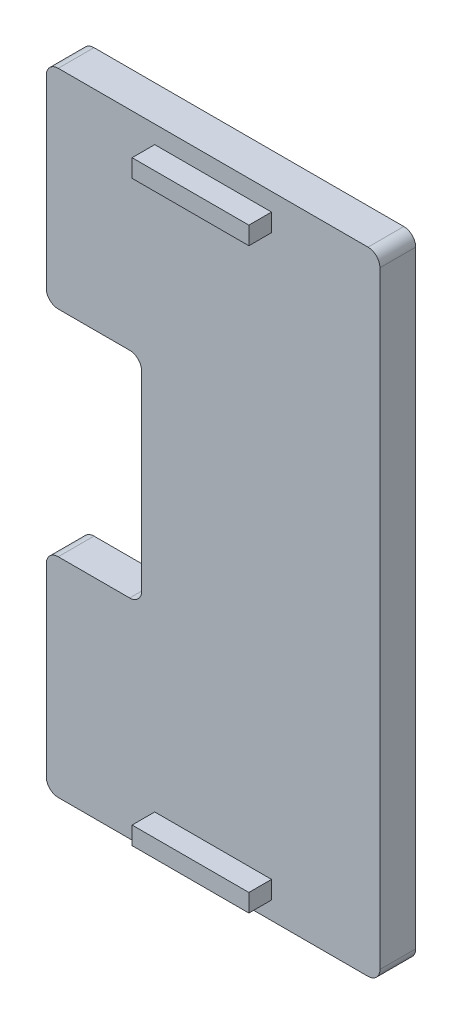
ISO-10303-21;
HEADER;
FILE_DESCRIPTION(('STEP AP214'),'2;1');
FILE_NAME('part.step','',(''),(''),'','','');
FILE_SCHEMA(('AUTOMOTIVE_DESIGN { 1 0 10303 214 1 1 1 1 }'));
ENDSEC;
DATA;
#1=APPLICATION_CONTEXT('core data for automotive mechanical design processes');
#2=APPLICATION_PROTOCOL_DEFINITION('international standard','automotive_design',2000,#1);
#3=PRODUCT_CONTEXT('',#1,'mechanical');
#4=PRODUCT('Part','Part','',(#3));
#5=PRODUCT_RELATED_PRODUCT_CATEGORY('part','',(#4));
#6=PRODUCT_DEFINITION_FORMATION('','',#4);
#7=PRODUCT_DEFINITION_CONTEXT('part definition',#1,'design');
#8=PRODUCT_DEFINITION('design','',#6,#7);
#9=PRODUCT_DEFINITION_SHAPE('','',#8);
#10=(LENGTH_UNIT() NAMED_UNIT(*) SI_UNIT(.MILLI.,.METRE.));
#11=(NAMED_UNIT(*) PLANE_ANGLE_UNIT() SI_UNIT($,.RADIAN.));
#12=(NAMED_UNIT(*) SI_UNIT($,.STERADIAN.) SOLID_ANGLE_UNIT());
#13=UNCERTAINTY_MEASURE_WITH_UNIT(LENGTH_MEASURE(1.E-05),#10,'distance_accuracy_value','');
#14=(GEOMETRIC_REPRESENTATION_CONTEXT(3) GLOBAL_UNCERTAINTY_ASSIGNED_CONTEXT((#13)) GLOBAL_UNIT_ASSIGNED_CONTEXT((#10,
#11,#12)) REPRESENTATION_CONTEXT('',''));
#15=CARTESIAN_POINT('',(0.,0.,0.));
#16=DIRECTION('',(0.,0.,1.));
#17=DIRECTION('',(1.,0.,0.));
#18=AXIS2_PLACEMENT_3D('',#15,#16,#17);
#19=CARTESIAN_POINT('',(-3.00000000000002,0.,3.));
#20=DIRECTION('',(-1.,0.,0.));
#21=DIRECTION('',(0.,0.,1.));
#22=AXIS2_PLACEMENT_3D('',#19,#20,#21);
#23=PLANE('',#22);
#24=DIRECTION('',(0.,1.,0.));
#25=VECTOR('',#24,1.);
#26=CARTESIAN_POINT('',(-3.00000000000002,0.,3.));
#27=LINE('',#26,#25);
#28=CARTESIAN_POINT('',(-3.00000000000002,33.5,3.));
#29=VERTEX_POINT('',#28);
#30=CARTESIAN_POINT('',(-3.00000000000002,49.,3.));
#31=VERTEX_POINT('',#30);
#32=EDGE_CURVE('E356',#29,#31,#27,.T.);
#33=ORIENTED_EDGE('',*,*,#32,.T.);
#34=DIRECTION('',(0.,0.,-1.));
#35=VECTOR('',#34,1.);
#36=CARTESIAN_POINT('',(-3.00000000000002,49.,3.));
#37=LINE('',#36,#35);
#38=CARTESIAN_POINT('',(-3.00000000000002,49.,0.));
#39=VERTEX_POINT('',#38);
#40=EDGE_CURVE('E413',#31,#39,#37,.T.);
#41=ORIENTED_EDGE('',*,*,#40,.T.);
#42=DIRECTION('',(0.,1.,0.));
#43=VECTOR('',#42,1.);
#44=CARTESIAN_POINT('',(-3.00000000000002,0.,0.));
#45=LINE('',#44,#43);
#46=CARTESIAN_POINT('',(-3.00000000000002,33.5,0.));
#47=VERTEX_POINT('',#46);
#48=EDGE_CURVE('E367',#47,#39,#45,.T.);
#49=ORIENTED_EDGE('',*,*,#48,.F.);
#50=DIRECTION('',(0.,0.,-1.));
#51=VECTOR('',#50,1.);
#52=CARTESIAN_POINT('',(-3.00000000000002,33.5,3.));
#53=LINE('',#52,#51);
#54=EDGE_CURVE('E128',#47,#29,#53,.F.);
#55=ORIENTED_EDGE('',*,*,#54,.T.);
#56=EDGE_LOOP('',(#33,#41,#49,#55));
#57=FACE_BOUND('',#56,.T.);
#58=ADVANCED_FACE('F106',(#57),#23,.T.);
#59=CARTESIAN_POINT('',(0.,0.,3.));
#60=DIRECTION('',(0.,0.,1.));
#61=DIRECTION('',(1.,0.,0.));
#62=AXIS2_PLACEMENT_3D('',#59,#60,#61);
#63=PLANE('',#62);
#64=CARTESIAN_POINT('',(-3.00000000000002,-1.99999999999999,3.));
#65=VERTEX_POINT('',#64);
#66=CARTESIAN_POINT('',(-3.00000000000002,13.5,3.));
#67=VERTEX_POINT('',#66);
#68=EDGE_CURVE('E358',#65,#67,#27,.T.);
#69=ORIENTED_EDGE('',*,*,#68,.F.);
#70=CARTESIAN_POINT('',(-2.00000000000002,-1.99999999999999,3.));
#71=DIRECTION('',(0.,0.,1.));
#72=DIRECTION('',(1.,0.,0.));
#73=AXIS2_PLACEMENT_3D('',#70,#71,#72);
#74=CIRCLE('',#73,1.);
#75=CARTESIAN_POINT('',(-2.00000000000002,-2.99999999999999,3.));
#76=VERTEX_POINT('',#75);
#77=EDGE_CURVE('E400',#65,#76,#74,.T.);
#78=ORIENTED_EDGE('',*,*,#77,.T.);
#79=DIRECTION('',(1.,0.,0.));
#80=VECTOR('',#79,1.);
#81=CARTESIAN_POINT('',(0.,-2.99999999999999,3.));
#82=LINE('',#81,#80);
#83=CARTESIAN_POINT('',(24.,-2.99999999999999,3.));
#84=VERTEX_POINT('',#83);
#85=EDGE_CURVE('E346',#76,#84,#82,.T.);
#86=ORIENTED_EDGE('',*,*,#85,.T.);
#87=CARTESIAN_POINT('',(24.,-1.99999999999999,3.));
#88=DIRECTION('',(0.,0.,1.));
#89=DIRECTION('',(1.,0.,0.));
#90=AXIS2_PLACEMENT_3D('',#87,#88,#89);
#91=CIRCLE('',#90,1.);
#92=CARTESIAN_POINT('',(25.,-1.99999999999999,3.));
#93=VERTEX_POINT('',#92);
#94=EDGE_CURVE('E398',#84,#93,#91,.T.);
#95=ORIENTED_EDGE('',*,*,#94,.T.);
#96=DIRECTION('',(0.,1.,0.));
#97=VECTOR('',#96,1.);
#98=CARTESIAN_POINT('',(25.,0.,3.));
#99=LINE('',#98,#97);
#100=CARTESIAN_POINT('',(25.,49.,3.));
#101=VERTEX_POINT('',#100);
#102=EDGE_CURVE('E349',#93,#101,#99,.T.);
#103=ORIENTED_EDGE('',*,*,#102,.T.);
#104=CARTESIAN_POINT('',(24.,49.,3.));
#105=DIRECTION('',(0.,0.,1.));
#106=DIRECTION('',(1.,0.,0.));
#107=AXIS2_PLACEMENT_3D('',#104,#105,#106);
#108=CIRCLE('',#107,1.);
#109=CARTESIAN_POINT('',(24.,50.,3.));
#110=VERTEX_POINT('',#109);
#111=EDGE_CURVE('E396',#101,#110,#108,.T.);
#112=ORIENTED_EDGE('',*,*,#111,.T.);
#113=DIRECTION('',(1.,0.,0.));
#114=VECTOR('',#113,1.);
#115=CARTESIAN_POINT('',(0.,50.,3.));
#116=LINE('',#115,#114);
#117=CARTESIAN_POINT('',(-2.00000000000002,50.,3.));
#118=VERTEX_POINT('',#117);
#119=EDGE_CURVE('E353',#118,#110,#116,.T.);
#120=ORIENTED_EDGE('',*,*,#119,.F.);
#121=CARTESIAN_POINT('',(-2.00000000000002,49.,3.));
#122=DIRECTION('',(0.,0.,1.));
#123=DIRECTION('',(1.,0.,0.));
#124=AXIS2_PLACEMENT_3D('',#121,#122,#123);
#125=CIRCLE('',#124,1.);
#126=EDGE_CURVE('E121',#118,#31,#125,.T.);
#127=ORIENTED_EDGE('',*,*,#126,.T.);
#128=ORIENTED_EDGE('',*,*,#32,.F.);
#129=CARTESIAN_POINT('',(-2.00000000000002,33.5,3.));
#130=DIRECTION('',(0.,0.,1.));
#131=DIRECTION('',(1.,0.,0.));
#132=AXIS2_PLACEMENT_3D('',#129,#130,#131);
#133=CIRCLE('',#132,1.);
#134=CARTESIAN_POINT('',(-2.00000000000002,32.5,3.));
#135=VERTEX_POINT('',#134);
#136=EDGE_CURVE('E391',#29,#135,#133,.T.);
#137=ORIENTED_EDGE('',*,*,#136,.T.);
#138=DIRECTION('',(-1.,0.,0.));
#139=VECTOR('',#138,1.);
#140=CARTESIAN_POINT('',(0.,32.5,3.));
#141=LINE('',#140,#139);
#142=CARTESIAN_POINT('',(4.,32.5,3.));
#143=VERTEX_POINT('',#142);
#144=EDGE_CURVE('E462',#143,#135,#141,.T.);
#145=ORIENTED_EDGE('',*,*,#144,.F.);
#146=CARTESIAN_POINT('',(4.,31.5,3.));
#147=DIRECTION('',(0.,0.,1.));
#148=DIRECTION('',(1.,0.,0.));
#149=AXIS2_PLACEMENT_3D('',#146,#147,#148);
#150=CIRCLE('',#149,1.);
#151=CARTESIAN_POINT('',(5.,31.5,3.));
#152=VERTEX_POINT('',#151);
#153=EDGE_CURVE('E12',#143,#152,#150,.F.);
#154=ORIENTED_EDGE('',*,*,#153,.T.);
#155=DIRECTION('',(0.,1.,0.));
#156=VECTOR('',#155,1.);
#157=CARTESIAN_POINT('',(5.,0.,3.));
#158=LINE('',#157,#156);
#159=CARTESIAN_POINT('',(5.,15.5,3.));
#160=VERTEX_POINT('',#159);
#161=EDGE_CURVE('E298',#160,#152,#158,.T.);
#162=ORIENTED_EDGE('',*,*,#161,.F.);
#163=CARTESIAN_POINT('',(4.,15.5,3.));
#164=DIRECTION('',(0.,0.,1.));
#165=DIRECTION('',(1.,0.,0.));
#166=AXIS2_PLACEMENT_3D('',#163,#164,#165);
#167=CIRCLE('',#166,1.);
#168=CARTESIAN_POINT('',(4.,14.5,3.));
#169=VERTEX_POINT('',#168);
#170=EDGE_CURVE('E434',#160,#169,#167,.F.);
#171=ORIENTED_EDGE('',*,*,#170,.T.);
#172=DIRECTION('',(1.,0.,0.));
#173=VECTOR('',#172,1.);
#174=CARTESIAN_POINT('',(0.,14.5,3.));
#175=LINE('',#174,#173);
#176=CARTESIAN_POINT('',(-2.00000000000002,14.5,3.));
#177=VERTEX_POINT('',#176);
#178=EDGE_CURVE('E452',#177,#169,#175,.T.);
#179=ORIENTED_EDGE('',*,*,#178,.F.);
#180=CARTESIAN_POINT('',(-2.00000000000002,13.5,3.));
#181=DIRECTION('',(0.,0.,1.));
#182=DIRECTION('',(1.,0.,0.));
#183=AXIS2_PLACEMENT_3D('',#180,#181,#182);
#184=CIRCLE('',#183,1.);
#185=EDGE_CURVE('E393',#177,#67,#184,.T.);
#186=ORIENTED_EDGE('',*,*,#185,.T.);
#187=EDGE_LOOP('',(#69,#78,#86,#95,#103,#112,#120,#127,#128,#137,#145,#154,#162,#171,#179,#186));
#188=FACE_BOUND('',#187,.T.);
#189=DIRECTION('',(0.,1.,0.));
#190=VECTOR('',#189,1.);
#191=CARTESIAN_POINT('',(6.09999999999999,0.,3.));
#192=LINE('',#191,#190);
#193=CARTESIAN_POINT('',(6.09999999999999,-1.49999999999999,3.));
#194=VERTEX_POINT('',#193);
#195=CARTESIAN_POINT('',(6.09999999999999,0.,3.));
#196=VERTEX_POINT('',#195);
#197=EDGE_CURVE('E276',#194,#196,#192,.T.);
#198=ORIENTED_EDGE('',*,*,#197,.T.);
#199=DIRECTION('',(1.,0.,0.));
#200=VECTOR('',#199,1.);
#201=CARTESIAN_POINT('',(0.,0.,3.));
#202=LINE('',#201,#200);
#203=CARTESIAN_POINT('',(15.9,0.,3.));
#204=VERTEX_POINT('',#203);
#205=EDGE_CURVE('E293',#196,#204,#202,.T.);
#206=ORIENTED_EDGE('',*,*,#205,.T.);
#207=DIRECTION('',(0.,1.,0.));
#208=VECTOR('',#207,1.);
#209=CARTESIAN_POINT('',(15.9,0.,3.));
#210=LINE('',#209,#208);
#211=CARTESIAN_POINT('',(15.9,-1.49999999999999,3.));
#212=VERTEX_POINT('',#211);
#213=EDGE_CURVE('E295',#212,#204,#210,.T.);
#214=ORIENTED_EDGE('',*,*,#213,.F.);
#215=DIRECTION('',(1.,0.,0.));
#216=VECTOR('',#215,1.);
#217=CARTESIAN_POINT('',(0.,-1.49999999999999,3.));
#218=LINE('',#217,#216);
#219=EDGE_CURVE('E305',#194,#212,#218,.T.);
#220=ORIENTED_EDGE('',*,*,#219,.F.);
#221=EDGE_LOOP('',(#198,#206,#214,#220));
#222=FACE_BOUND('',#221,.T.);
#223=DIRECTION('',(1.,0.,0.));
#224=VECTOR('',#223,1.);
#225=CARTESIAN_POINT('',(0.,48.5,3.));
#226=LINE('',#225,#224);
#227=CARTESIAN_POINT('',(6.09999999999999,48.5,3.));
#228=VERTEX_POINT('',#227);
#229=CARTESIAN_POINT('',(15.9,48.5,3.));
#230=VERTEX_POINT('',#229);
#231=EDGE_CURVE('E279',#228,#230,#226,.T.);
#232=ORIENTED_EDGE('',*,*,#231,.T.);
#233=DIRECTION('',(0.,-1.,0.));
#234=VECTOR('',#233,1.);
#235=CARTESIAN_POINT('',(15.9,0.,3.));
#236=LINE('',#235,#234);
#237=CARTESIAN_POINT('',(15.9,47.,3.));
#238=VERTEX_POINT('',#237);
#239=EDGE_CURVE('E318',#230,#238,#236,.T.);
#240=ORIENTED_EDGE('',*,*,#239,.T.);
#241=DIRECTION('',(-1.,0.,0.));
#242=VECTOR('',#241,1.);
#243=CARTESIAN_POINT('',(0.,47.,3.));
#244=LINE('',#243,#242);
#245=CARTESIAN_POINT('',(6.09999999999999,47.,3.));
#246=VERTEX_POINT('',#245);
#247=EDGE_CURVE('E331',#238,#246,#244,.T.);
#248=ORIENTED_EDGE('',*,*,#247,.T.);
#249=DIRECTION('',(0.,-1.,0.));
#250=VECTOR('',#249,1.);
#251=CARTESIAN_POINT('',(6.09999999999999,0.,3.));
#252=LINE('',#251,#250);
#253=EDGE_CURVE('E328',#228,#246,#252,.T.);
#254=ORIENTED_EDGE('',*,*,#253,.F.);
#255=EDGE_LOOP('',(#232,#240,#248,#254));
#256=FACE_BOUND('',#255,.T.);
#257=ADVANCED_FACE('F459',(#188,#222,#256),#63,.T.);
#258=CARTESIAN_POINT('',(0.,0.,0.));
#259=DIRECTION('',(0.,0.,1.));
#260=DIRECTION('',(1.,0.,0.));
#261=AXIS2_PLACEMENT_3D('',#258,#259,#260);
#262=PLANE('',#261);
#263=DIRECTION('',(1.,0.,0.));
#264=VECTOR('',#263,1.);
#265=CARTESIAN_POINT('',(0.,-2.99999999999999,0.));
#266=LINE('',#265,#264);
#267=CARTESIAN_POINT('',(-2.00000000000002,-2.99999999999999,0.));
#268=VERTEX_POINT('',#267);
#269=CARTESIAN_POINT('',(24.,-2.99999999999999,0.));
#270=VERTEX_POINT('',#269);
#271=EDGE_CURVE('E345',#268,#270,#266,.T.);
#272=ORIENTED_EDGE('',*,*,#271,.F.);
#273=CARTESIAN_POINT('',(-2.00000000000002,-1.99999999999999,0.));
#274=DIRECTION('',(0.,0.,1.));
#275=DIRECTION('',(1.,0.,0.));
#276=AXIS2_PLACEMENT_3D('',#273,#274,#275);
#277=CIRCLE('',#276,1.);
#278=CARTESIAN_POINT('',(-3.00000000000002,-1.99999999999999,0.));
#279=VERTEX_POINT('',#278);
#280=EDGE_CURVE('E385',#268,#279,#277,.F.);
#281=ORIENTED_EDGE('',*,*,#280,.T.);
#282=CARTESIAN_POINT('',(-3.00000000000002,13.5,0.));
#283=VERTEX_POINT('',#282);
#284=EDGE_CURVE('E350',#279,#283,#45,.T.);
#285=ORIENTED_EDGE('',*,*,#284,.T.);
#286=CARTESIAN_POINT('',(-2.00000000000002,13.5,0.));
#287=DIRECTION('',(0.,0.,1.));
#288=DIRECTION('',(1.,0.,0.));
#289=AXIS2_PLACEMENT_3D('',#286,#287,#288);
#290=CIRCLE('',#289,1.);
#291=CARTESIAN_POINT('',(-2.00000000000002,14.5,0.));
#292=VERTEX_POINT('',#291);
#293=EDGE_CURVE('E377',#283,#292,#290,.F.);
#294=ORIENTED_EDGE('',*,*,#293,.T.);
#295=DIRECTION('',(-1.,0.,0.));
#296=VECTOR('',#295,1.);
#297=CARTESIAN_POINT('',(-11.,14.5,0.));
#298=LINE('',#297,#296);
#299=CARTESIAN_POINT('',(4.,14.5,0.));
#300=VERTEX_POINT('',#299);
#301=EDGE_CURVE('E453',#300,#292,#298,.T.);
#302=ORIENTED_EDGE('',*,*,#301,.F.);
#303=CARTESIAN_POINT('',(4.,15.5,0.));
#304=DIRECTION('',(0.,0.,1.));
#305=DIRECTION('',(1.,0.,0.));
#306=AXIS2_PLACEMENT_3D('',#303,#304,#305);
#307=CIRCLE('',#306,1.);
#308=CARTESIAN_POINT('',(5.,15.5,0.));
#309=VERTEX_POINT('',#308);
#310=EDGE_CURVE('E432',#300,#309,#307,.T.);
#311=ORIENTED_EDGE('',*,*,#310,.T.);
#312=DIRECTION('',(0.,-1.,0.));
#313=VECTOR('',#312,1.);
#314=CARTESIAN_POINT('',(5.,14.5,0.));
#315=LINE('',#314,#313);
#316=CARTESIAN_POINT('',(5.,31.5,0.));
#317=VERTEX_POINT('',#316);
#318=EDGE_CURVE('E443',#317,#309,#315,.T.);
#319=ORIENTED_EDGE('',*,*,#318,.F.);
#320=CARTESIAN_POINT('',(4.,31.5,0.));
#321=DIRECTION('',(0.,0.,1.));
#322=DIRECTION('',(1.,0.,0.));
#323=AXIS2_PLACEMENT_3D('',#320,#321,#322);
#324=CIRCLE('',#323,1.);
#325=CARTESIAN_POINT('',(4.,32.5,0.));
#326=VERTEX_POINT('',#325);
#327=EDGE_CURVE('E114',#317,#326,#324,.T.);
#328=ORIENTED_EDGE('',*,*,#327,.T.);
#329=DIRECTION('',(1.,0.,0.));
#330=VECTOR('',#329,1.);
#331=CARTESIAN_POINT('',(-11.,32.5,0.));
#332=LINE('',#331,#330);
#333=CARTESIAN_POINT('',(-2.00000000000002,32.5,0.));
#334=VERTEX_POINT('',#333);
#335=EDGE_CURVE('E441',#334,#326,#332,.T.);
#336=ORIENTED_EDGE('',*,*,#335,.F.);
#337=CARTESIAN_POINT('',(-2.00000000000002,33.5,0.));
#338=DIRECTION('',(0.,0.,1.));
#339=DIRECTION('',(1.,0.,0.));
#340=AXIS2_PLACEMENT_3D('',#337,#338,#339);
#341=CIRCLE('',#340,1.);
#342=EDGE_CURVE('E375',#334,#47,#341,.F.);
#343=ORIENTED_EDGE('',*,*,#342,.T.);
#344=ORIENTED_EDGE('',*,*,#48,.T.);
#345=CARTESIAN_POINT('',(-2.00000000000002,49.,0.));
#346=DIRECTION('',(0.,0.,1.));
#347=DIRECTION('',(1.,0.,0.));
#348=AXIS2_PLACEMENT_3D('',#345,#346,#347);
#349=CIRCLE('',#348,1.);
#350=CARTESIAN_POINT('',(-2.00000000000002,50.,0.));
#351=VERTEX_POINT('',#350);
#352=EDGE_CURVE('E379',#39,#351,#349,.F.);
#353=ORIENTED_EDGE('',*,*,#352,.T.);
#354=DIRECTION('',(1.,0.,0.));
#355=VECTOR('',#354,1.);
#356=CARTESIAN_POINT('',(0.,50.,0.));
#357=LINE('',#356,#355);
#358=CARTESIAN_POINT('',(24.,50.,0.));
#359=VERTEX_POINT('',#358);
#360=EDGE_CURVE('E364',#351,#359,#357,.T.);
#361=ORIENTED_EDGE('',*,*,#360,.T.);
#362=CARTESIAN_POINT('',(24.,49.,0.));
#363=DIRECTION('',(0.,0.,1.));
#364=DIRECTION('',(1.,0.,0.));
#365=AXIS2_PLACEMENT_3D('',#362,#363,#364);
#366=CIRCLE('',#365,1.);
#367=CARTESIAN_POINT('',(25.,49.,0.));
#368=VERTEX_POINT('',#367);
#369=EDGE_CURVE('E381',#359,#368,#366,.F.);
#370=ORIENTED_EDGE('',*,*,#369,.T.);
#371=DIRECTION('',(0.,1.,0.));
#372=VECTOR('',#371,1.);
#373=CARTESIAN_POINT('',(25.,0.,0.));
#374=LINE('',#373,#372);
#375=CARTESIAN_POINT('',(25.,-1.99999999999999,0.));
#376=VERTEX_POINT('',#375);
#377=EDGE_CURVE('E361',#376,#368,#374,.T.);
#378=ORIENTED_EDGE('',*,*,#377,.F.);
#379=CARTESIAN_POINT('',(24.,-1.99999999999999,0.));
#380=DIRECTION('',(0.,0.,1.));
#381=DIRECTION('',(1.,0.,0.));
#382=AXIS2_PLACEMENT_3D('',#379,#380,#381);
#383=CIRCLE('',#382,1.);
#384=EDGE_CURVE('E383',#376,#270,#383,.F.);
#385=ORIENTED_EDGE('',*,*,#384,.T.);
#386=EDGE_LOOP('',(#272,#281,#285,#294,#302,#311,#319,#328,#336,#343,#344,#353,#361,#370,#378,#385));
#387=FACE_BOUND('',#386,.T.);
#388=ADVANCED_FACE('F440',(#387),#262,.F.);
#389=CARTESIAN_POINT('',(25.,0.,3.));
#390=DIRECTION('',(-1.,0.,0.));
#391=DIRECTION('',(0.,0.,1.));
#392=AXIS2_PLACEMENT_3D('',#389,#390,#391);
#393=PLANE('',#392);
#394=ORIENTED_EDGE('',*,*,#102,.F.);
#395=DIRECTION('',(0.,0.,-1.));
#396=VECTOR('',#395,1.);
#397=CARTESIAN_POINT('',(25.,-1.99999999999999,3.));
#398=LINE('',#397,#396);
#399=EDGE_CURVE('E404',#93,#376,#398,.T.);
#400=ORIENTED_EDGE('',*,*,#399,.T.);
#401=ORIENTED_EDGE('',*,*,#377,.T.);
#402=DIRECTION('',(0.,0.,-1.));
#403=VECTOR('',#402,1.);
#404=CARTESIAN_POINT('',(25.,49.,3.));
#405=LINE('',#404,#403);
#406=EDGE_CURVE('E402',#368,#101,#405,.F.);
#407=ORIENTED_EDGE('',*,*,#406,.T.);
#408=EDGE_LOOP('',(#394,#400,#401,#407));
#409=FACE_BOUND('',#408,.T.);
#410=ADVANCED_FACE('F503',(#409),#393,.F.);
#411=CARTESIAN_POINT('',(0.,50.,3.));
#412=DIRECTION('',(0.,1.,0.));
#413=DIRECTION('',(0.,0.,1.));
#414=AXIS2_PLACEMENT_3D('',#411,#412,#413);
#415=PLANE('',#414);
#416=ORIENTED_EDGE('',*,*,#119,.T.);
#417=DIRECTION('',(0.,0.,-1.));
#418=VECTOR('',#417,1.);
#419=CARTESIAN_POINT('',(24.,50.,0.));
#420=LINE('',#419,#418);
#421=EDGE_CURVE('E409',#110,#359,#420,.T.);
#422=ORIENTED_EDGE('',*,*,#421,.T.);
#423=ORIENTED_EDGE('',*,*,#360,.F.);
#424=DIRECTION('',(0.,0.,-1.));
#425=VECTOR('',#424,1.);
#426=CARTESIAN_POINT('',(-2.00000000000002,50.,3.));
#427=LINE('',#426,#425);
#428=EDGE_CURVE('E407',#351,#118,#427,.F.);
#429=ORIENTED_EDGE('',*,*,#428,.T.);
#430=EDGE_LOOP('',(#416,#422,#423,#429));
#431=FACE_BOUND('',#430,.T.);
#432=ADVANCED_FACE('F510',(#431),#415,.T.);
#433=ORIENTED_EDGE('',*,*,#284,.F.);
#434=DIRECTION('',(0.,0.,-1.));
#435=VECTOR('',#434,1.);
#436=CARTESIAN_POINT('',(-3.00000000000002,-1.99999999999999,3.));
#437=LINE('',#436,#435);
#438=EDGE_CURVE('E389',#279,#65,#437,.F.);
#439=ORIENTED_EDGE('',*,*,#438,.T.);
#440=ORIENTED_EDGE('',*,*,#68,.T.);
#441=DIRECTION('',(0.,0.,1.));
#442=VECTOR('',#441,1.);
#443=CARTESIAN_POINT('',(-3.00000000000002,13.5,0.));
#444=LINE('',#443,#442);
#445=EDGE_CURVE('E387',#67,#283,#444,.F.);
#446=ORIENTED_EDGE('',*,*,#445,.T.);
#447=EDGE_LOOP('',(#433,#439,#440,#446));
#448=FACE_BOUND('',#447,.T.);
#449=ADVANCED_FACE('F487',(#448),#23,.T.);
#450=CARTESIAN_POINT('',(0.,-2.99999999999999,3.));
#451=DIRECTION('',(0.,1.,0.));
#452=DIRECTION('',(0.,0.,1.));
#453=AXIS2_PLACEMENT_3D('',#450,#451,#452);
#454=PLANE('',#453);
#455=ORIENTED_EDGE('',*,*,#85,.F.);
#456=DIRECTION('',(0.,0.,-1.));
#457=VECTOR('',#456,1.);
#458=CARTESIAN_POINT('',(-2.00000000000002,-2.99999999999999,0.));
#459=LINE('',#458,#457);
#460=EDGE_CURVE('E372',#76,#268,#459,.T.);
#461=ORIENTED_EDGE('',*,*,#460,.T.);
#462=ORIENTED_EDGE('',*,*,#271,.T.);
#463=DIRECTION('',(0.,0.,-1.));
#464=VECTOR('',#463,1.);
#465=CARTESIAN_POINT('',(24.,-2.99999999999999,3.));
#466=LINE('',#465,#464);
#467=EDGE_CURVE('E370',#270,#84,#466,.F.);
#468=ORIENTED_EDGE('',*,*,#467,.T.);
#469=EDGE_LOOP('',(#455,#461,#462,#468));
#470=FACE_BOUND('',#469,.T.);
#471=ADVANCED_FACE('F495',(#470),#454,.F.);
#472=CARTESIAN_POINT('',(0.,48.5,4.9));
#473=DIRECTION('',(0.,1.,0.));
#474=DIRECTION('',(0.,0.,1.));
#475=AXIS2_PLACEMENT_3D('',#472,#473,#474);
#476=PLANE('',#475);
#477=ORIENTED_EDGE('',*,*,#231,.F.);
#478=DIRECTION('',(0.,0.,-1.));
#479=VECTOR('',#478,1.);
#480=CARTESIAN_POINT('',(6.09999999999999,48.5,4.9));
#481=LINE('',#480,#479);
#482=CARTESIAN_POINT('',(6.09999999999999,48.5,4.9));
#483=VERTEX_POINT('',#482);
#484=EDGE_CURVE('E342',#483,#228,#481,.T.);
#485=ORIENTED_EDGE('',*,*,#484,.F.);
#486=DIRECTION('',(1.,0.,0.));
#487=VECTOR('',#486,1.);
#488=CARTESIAN_POINT('',(0.,48.5,4.9));
#489=LINE('',#488,#487);
#490=CARTESIAN_POINT('',(15.9,48.5,4.9));
#491=VERTEX_POINT('',#490);
#492=EDGE_CURVE('E314',#483,#491,#489,.T.);
#493=ORIENTED_EDGE('',*,*,#492,.T.);
#494=DIRECTION('',(0.,0.,-1.));
#495=VECTOR('',#494,1.);
#496=CARTESIAN_POINT('',(15.9,48.5,4.9));
#497=LINE('',#496,#495);
#498=EDGE_CURVE('E326',#491,#230,#497,.T.);
#499=ORIENTED_EDGE('',*,*,#498,.T.);
#500=EDGE_LOOP('',(#477,#485,#493,#499));
#501=FACE_BOUND('',#500,.T.);
#502=ADVANCED_FACE('F532',(#501),#476,.T.);
#503=CARTESIAN_POINT('',(6.09999999999999,0.,4.9));
#504=DIRECTION('',(1.,0.,0.));
#505=DIRECTION('',(0.,0.,-1.));
#506=AXIS2_PLACEMENT_3D('',#503,#504,#505);
#507=PLANE('',#506);
#508=ORIENTED_EDGE('',*,*,#253,.T.);
#509=DIRECTION('',(0.,0.,-1.));
#510=VECTOR('',#509,1.);
#511=CARTESIAN_POINT('',(6.09999999999999,47.,4.9));
#512=LINE('',#511,#510);
#513=CARTESIAN_POINT('',(6.09999999999999,47.,4.9));
#514=VERTEX_POINT('',#513);
#515=EDGE_CURVE('E339',#514,#246,#512,.T.);
#516=ORIENTED_EDGE('',*,*,#515,.F.);
#517=DIRECTION('',(0.,-1.,0.));
#518=VECTOR('',#517,1.);
#519=CARTESIAN_POINT('',(6.09999999999999,0.,4.9));
#520=LINE('',#519,#518);
#521=EDGE_CURVE('E317',#483,#514,#520,.T.);
#522=ORIENTED_EDGE('',*,*,#521,.F.);
#523=ORIENTED_EDGE('',*,*,#484,.T.);
#524=EDGE_LOOP('',(#508,#516,#522,#523));
#525=FACE_BOUND('',#524,.T.);
#526=ADVANCED_FACE('F544',(#525),#507,.F.);
#527=CARTESIAN_POINT('',(0.,47.,4.9));
#528=DIRECTION('',(0.,-1.,0.));
#529=DIRECTION('',(0.,0.,-1.));
#530=AXIS2_PLACEMENT_3D('',#527,#528,#529);
#531=PLANE('',#530);
#532=ORIENTED_EDGE('',*,*,#247,.F.);
#533=DIRECTION('',(0.,0.,-1.));
#534=VECTOR('',#533,1.);
#535=CARTESIAN_POINT('',(15.9,47.,4.9));
#536=LINE('',#535,#534);
#537=CARTESIAN_POINT('',(15.9,47.,4.9));
#538=VERTEX_POINT('',#537);
#539=EDGE_CURVE('E336',#538,#238,#536,.T.);
#540=ORIENTED_EDGE('',*,*,#539,.F.);
#541=DIRECTION('',(-1.,0.,0.));
#542=VECTOR('',#541,1.);
#543=CARTESIAN_POINT('',(0.,47.,4.9));
#544=LINE('',#543,#542);
#545=EDGE_CURVE('E320',#538,#514,#544,.T.);
#546=ORIENTED_EDGE('',*,*,#545,.T.);
#547=ORIENTED_EDGE('',*,*,#515,.T.);
#548=EDGE_LOOP('',(#532,#540,#546,#547));
#549=FACE_BOUND('',#548,.T.);
#550=ADVANCED_FACE('F548',(#549),#531,.T.);
#551=CARTESIAN_POINT('',(15.9,0.,4.9));
#552=DIRECTION('',(1.,0.,0.));
#553=DIRECTION('',(0.,0.,-1.));
#554=AXIS2_PLACEMENT_3D('',#551,#552,#553);
#555=PLANE('',#554);
#556=ORIENTED_EDGE('',*,*,#239,.F.);
#557=ORIENTED_EDGE('',*,*,#498,.F.);
#558=DIRECTION('',(0.,-1.,0.));
#559=VECTOR('',#558,1.);
#560=CARTESIAN_POINT('',(15.9,0.,4.9));
#561=LINE('',#560,#559);
#562=EDGE_CURVE('E323',#491,#538,#561,.T.);
#563=ORIENTED_EDGE('',*,*,#562,.T.);
#564=ORIENTED_EDGE('',*,*,#539,.T.);
#565=EDGE_LOOP('',(#556,#557,#563,#564));
#566=FACE_BOUND('',#565,.T.);
#567=ADVANCED_FACE('F552',(#566),#555,.T.);
#568=CARTESIAN_POINT('',(0.,0.,4.9));
#569=DIRECTION('',(0.,0.,1.));
#570=DIRECTION('',(1.,0.,0.));
#571=AXIS2_PLACEMENT_3D('',#568,#569,#570);
#572=PLANE('',#571);
#573=ORIENTED_EDGE('',*,*,#492,.F.);
#574=ORIENTED_EDGE('',*,*,#521,.T.);
#575=ORIENTED_EDGE('',*,*,#545,.F.);
#576=ORIENTED_EDGE('',*,*,#562,.F.);
#577=EDGE_LOOP('',(#573,#574,#575,#576));
#578=FACE_BOUND('',#577,.T.);
#579=ADVANCED_FACE('F556',(#578),#572,.T.);
#580=CARTESIAN_POINT('',(6.09999999999999,0.,4.9));
#581=DIRECTION('',(-1.,0.,0.));
#582=DIRECTION('',(0.,0.,1.));
#583=AXIS2_PLACEMENT_3D('',#580,#581,#582);
#584=PLANE('',#583);
#585=ORIENTED_EDGE('',*,*,#197,.F.);
#586=DIRECTION('',(0.,0.,-1.));
#587=VECTOR('',#586,1.);
#588=CARTESIAN_POINT('',(6.09999999999999,-1.49999999999999,4.9));
#589=LINE('',#588,#587);
#590=CARTESIAN_POINT('',(6.09999999999999,-1.49999999999999,4.9));
#591=VERTEX_POINT('',#590);
#592=EDGE_CURVE('E269',#591,#194,#589,.T.);
#593=ORIENTED_EDGE('',*,*,#592,.F.);
#594=DIRECTION('',(0.,1.,0.));
#595=VECTOR('',#594,1.);
#596=CARTESIAN_POINT('',(6.09999999999999,0.,4.9));
#597=LINE('',#596,#595);
#598=CARTESIAN_POINT('',(6.09999999999999,0.,4.9));
#599=VERTEX_POINT('',#598);
#600=EDGE_CURVE('E274',#591,#599,#597,.T.);
#601=ORIENTED_EDGE('',*,*,#600,.T.);
#602=DIRECTION('',(0.,0.,-1.));
#603=VECTOR('',#602,1.);
#604=CARTESIAN_POINT('',(6.09999999999999,0.,4.9));
#605=LINE('',#604,#603);
#606=EDGE_CURVE('E303',#599,#196,#605,.T.);
#607=ORIENTED_EDGE('',*,*,#606,.T.);
#608=EDGE_LOOP('',(#585,#593,#601,#607));
#609=FACE_BOUND('',#608,.T.);
#610=ADVANCED_FACE('F271',(#609),#584,.T.);
#611=CARTESIAN_POINT('',(0.,-1.49999999999999,4.9));
#612=DIRECTION('',(0.,1.,0.));
#613=DIRECTION('',(0.,0.,1.));
#614=AXIS2_PLACEMENT_3D('',#611,#612,#613);
#615=PLANE('',#614);
#616=ORIENTED_EDGE('',*,*,#219,.T.);
#617=DIRECTION('',(0.,0.,-1.));
#618=VECTOR('',#617,1.);
#619=CARTESIAN_POINT('',(15.9,-1.49999999999999,4.9));
#620=LINE('',#619,#618);
#621=CARTESIAN_POINT('',(15.9,-1.49999999999999,4.9));
#622=VERTEX_POINT('',#621);
#623=EDGE_CURVE('E280',#622,#212,#620,.T.);
#624=ORIENTED_EDGE('',*,*,#623,.F.);
#625=DIRECTION('',(1.,0.,0.));
#626=VECTOR('',#625,1.);
#627=CARTESIAN_POINT('',(0.,-1.49999999999999,4.9));
#628=LINE('',#627,#626);
#629=EDGE_CURVE('E283',#591,#622,#628,.T.);
#630=ORIENTED_EDGE('',*,*,#629,.F.);
#631=ORIENTED_EDGE('',*,*,#592,.T.);
#632=EDGE_LOOP('',(#616,#624,#630,#631));
#633=FACE_BOUND('',#632,.T.);
#634=ADVANCED_FACE('F284',(#633),#615,.F.);
#635=CARTESIAN_POINT('',(15.9,0.,4.9));
#636=DIRECTION('',(-1.,0.,0.));
#637=DIRECTION('',(0.,0.,1.));
#638=AXIS2_PLACEMENT_3D('',#635,#636,#637);
#639=PLANE('',#638);
#640=ORIENTED_EDGE('',*,*,#213,.T.);
#641=DIRECTION('',(0.,0.,-1.));
#642=VECTOR('',#641,1.);
#643=CARTESIAN_POINT('',(15.9,0.,4.9));
#644=LINE('',#643,#642);
#645=CARTESIAN_POINT('',(15.9,0.,4.9));
#646=VERTEX_POINT('',#645);
#647=EDGE_CURVE('E310',#646,#204,#644,.T.);
#648=ORIENTED_EDGE('',*,*,#647,.F.);
#649=DIRECTION('',(0.,1.,0.));
#650=VECTOR('',#649,1.);
#651=CARTESIAN_POINT('',(15.9,0.,4.9));
#652=LINE('',#651,#650);
#653=EDGE_CURVE('E288',#622,#646,#652,.T.);
#654=ORIENTED_EDGE('',*,*,#653,.F.);
#655=ORIENTED_EDGE('',*,*,#623,.T.);
#656=EDGE_LOOP('',(#640,#648,#654,#655));
#657=FACE_BOUND('',#656,.T.);
#658=ADVANCED_FACE('F565',(#657),#639,.F.);
#659=CARTESIAN_POINT('',(0.,0.,4.9));
#660=DIRECTION('',(0.,1.,0.));
#661=DIRECTION('',(-1.,0.,0.));
#662=AXIS2_PLACEMENT_3D('',#659,#660,#661);
#663=PLANE('',#662);
#664=ORIENTED_EDGE('',*,*,#205,.F.);
#665=ORIENTED_EDGE('',*,*,#606,.F.);
#666=DIRECTION('',(1.,0.,0.));
#667=VECTOR('',#666,1.);
#668=CARTESIAN_POINT('',(0.,0.,4.9));
#669=LINE('',#668,#667);
#670=EDGE_CURVE('E292',#599,#646,#669,.T.);
#671=ORIENTED_EDGE('',*,*,#670,.T.);
#672=ORIENTED_EDGE('',*,*,#647,.T.);
#673=EDGE_LOOP('',(#664,#665,#671,#672));
#674=FACE_BOUND('',#673,.T.);
#675=ADVANCED_FACE('F568',(#674),#663,.T.);
#676=CARTESIAN_POINT('',(0.,0.,4.9));
#677=DIRECTION('',(0.,0.,1.));
#678=DIRECTION('',(1.,0.,0.));
#679=AXIS2_PLACEMENT_3D('',#676,#677,#678);
#680=PLANE('',#679);
#681=ORIENTED_EDGE('',*,*,#600,.F.);
#682=ORIENTED_EDGE('',*,*,#629,.T.);
#683=ORIENTED_EDGE('',*,*,#653,.T.);
#684=ORIENTED_EDGE('',*,*,#670,.F.);
#685=EDGE_LOOP('',(#681,#682,#683,#684));
#686=FACE_BOUND('',#685,.T.);
#687=ADVANCED_FACE('F290',(#686),#680,.T.);
#688=CARTESIAN_POINT('',(5.,14.5,4.9));
#689=DIRECTION('',(1.,0.,0.));
#690=DIRECTION('',(0.,0.,-1.));
#691=AXIS2_PLACEMENT_3D('',#688,#689,#690);
#692=PLANE('',#691);
#693=ORIENTED_EDGE('',*,*,#318,.T.);
#694=DIRECTION('',(0.,0.,-1.));
#695=VECTOR('',#694,1.);
#696=CARTESIAN_POINT('',(5.,15.5,3.));
#697=LINE('',#696,#695);
#698=EDGE_CURVE('E425',#309,#160,#697,.F.);
#699=ORIENTED_EDGE('',*,*,#698,.T.);
#700=ORIENTED_EDGE('',*,*,#161,.T.);
#701=DIRECTION('',(0.,0.,-1.));
#702=VECTOR('',#701,1.);
#703=CARTESIAN_POINT('',(5.,31.5,0.));
#704=LINE('',#703,#702);
#705=EDGE_CURVE('E422',#152,#317,#704,.T.);
#706=ORIENTED_EDGE('',*,*,#705,.T.);
#707=EDGE_LOOP('',(#693,#699,#700,#706));
#708=FACE_BOUND('',#707,.T.);
#709=ADVANCED_FACE('F464',(#708),#692,.F.);
#710=CARTESIAN_POINT('',(-11.,32.5,4.9));
#711=DIRECTION('',(0.,1.,0.));
#712=DIRECTION('',(0.,0.,1.));
#713=AXIS2_PLACEMENT_3D('',#710,#711,#712);
#714=PLANE('',#713);
#715=ORIENTED_EDGE('',*,*,#144,.T.);
#716=DIRECTION('',(0.,0.,-1.));
#717=VECTOR('',#716,1.);
#718=CARTESIAN_POINT('',(-2.00000000000002,32.5,0.));
#719=LINE('',#718,#717);
#720=EDGE_CURVE('E429',#135,#334,#719,.T.);
#721=ORIENTED_EDGE('',*,*,#720,.T.);
#722=ORIENTED_EDGE('',*,*,#335,.T.);
#723=DIRECTION('',(0.,0.,-1.));
#724=VECTOR('',#723,1.);
#725=CARTESIAN_POINT('',(4.,32.5,3.));
#726=LINE('',#725,#724);
#727=EDGE_CURVE('E427',#326,#143,#726,.F.);
#728=ORIENTED_EDGE('',*,*,#727,.T.);
#729=EDGE_LOOP('',(#715,#721,#722,#728));
#730=FACE_BOUND('',#729,.T.);
#731=ADVANCED_FACE('F449',(#730),#714,.F.);
#732=CARTESIAN_POINT('',(-11.,14.5,4.9));
#733=DIRECTION('',(0.,-1.,0.));
#734=DIRECTION('',(1.,0.,0.));
#735=AXIS2_PLACEMENT_3D('',#732,#733,#734);
#736=PLANE('',#735);
#737=ORIENTED_EDGE('',*,*,#301,.T.);
#738=DIRECTION('',(0.,0.,1.));
#739=VECTOR('',#738,1.);
#740=CARTESIAN_POINT('',(-2.00000000000002,14.5,3.));
#741=LINE('',#740,#739);
#742=EDGE_CURVE('E419',#292,#177,#741,.T.);
#743=ORIENTED_EDGE('',*,*,#742,.T.);
#744=ORIENTED_EDGE('',*,*,#178,.T.);
#745=DIRECTION('',(0.,0.,-1.));
#746=VECTOR('',#745,1.);
#747=CARTESIAN_POINT('',(4.,14.5,0.));
#748=LINE('',#747,#746);
#749=EDGE_CURVE('E416',#169,#300,#748,.T.);
#750=ORIENTED_EDGE('',*,*,#749,.T.);
#751=EDGE_LOOP('',(#737,#743,#744,#750));
#752=FACE_BOUND('',#751,.T.);
#753=ADVANCED_FACE('F476',(#752),#736,.F.);
#754=CARTESIAN_POINT('',(-2.00000000000002,-1.99999999999999,3.));
#755=DIRECTION('',(0.,0.,1.));
#756=DIRECTION('',(1.,0.,0.));
#757=AXIS2_PLACEMENT_3D('',#754,#755,#756);
#758=CYLINDRICAL_SURFACE('',#757,1.);
#759=ORIENTED_EDGE('',*,*,#77,.F.);
#760=ORIENTED_EDGE('',*,*,#438,.F.);
#761=ORIENTED_EDGE('',*,*,#280,.F.);
#762=ORIENTED_EDGE('',*,*,#460,.F.);
#763=EDGE_LOOP('',(#759,#760,#761,#762));
#764=FACE_BOUND('',#763,.T.);
#765=ADVANCED_FACE('F490',(#764),#758,.T.);
#766=CARTESIAN_POINT('',(24.,-1.99999999999999,3.));
#767=DIRECTION('',(0.,0.,-1.));
#768=DIRECTION('',(-1.,0.,0.));
#769=AXIS2_PLACEMENT_3D('',#766,#767,#768);
#770=CYLINDRICAL_SURFACE('',#769,1.);
#771=ORIENTED_EDGE('',*,*,#94,.F.);
#772=ORIENTED_EDGE('',*,*,#467,.F.);
#773=ORIENTED_EDGE('',*,*,#384,.F.);
#774=ORIENTED_EDGE('',*,*,#399,.F.);
#775=EDGE_LOOP('',(#771,#772,#773,#774));
#776=FACE_BOUND('',#775,.T.);
#777=ADVANCED_FACE('F498',(#776),#770,.T.);
#778=CARTESIAN_POINT('',(24.,49.,3.));
#779=DIRECTION('',(0.,0.,1.));
#780=DIRECTION('',(1.,0.,0.));
#781=AXIS2_PLACEMENT_3D('',#778,#779,#780);
#782=CYLINDRICAL_SURFACE('',#781,1.);
#783=ORIENTED_EDGE('',*,*,#111,.F.);
#784=ORIENTED_EDGE('',*,*,#406,.F.);
#785=ORIENTED_EDGE('',*,*,#369,.F.);
#786=ORIENTED_EDGE('',*,*,#421,.F.);
#787=EDGE_LOOP('',(#783,#784,#785,#786));
#788=FACE_BOUND('',#787,.T.);
#789=ADVANCED_FACE('F507',(#788),#782,.T.);
#790=CARTESIAN_POINT('',(-2.00000000000002,49.,3.));
#791=DIRECTION('',(0.,0.,-1.));
#792=DIRECTION('',(-1.,0.,0.));
#793=AXIS2_PLACEMENT_3D('',#790,#791,#792);
#794=CYLINDRICAL_SURFACE('',#793,1.);
#795=ORIENTED_EDGE('',*,*,#126,.F.);
#796=ORIENTED_EDGE('',*,*,#428,.F.);
#797=ORIENTED_EDGE('',*,*,#352,.F.);
#798=ORIENTED_EDGE('',*,*,#40,.F.);
#799=EDGE_LOOP('',(#795,#796,#797,#798));
#800=FACE_BOUND('',#799,.T.);
#801=ADVANCED_FACE('F514',(#800),#794,.T.);
#802=CARTESIAN_POINT('',(-2.00000000000002,13.5,4.9));
#803=DIRECTION('',(0.,0.,-1.));
#804=DIRECTION('',(-1.,0.,0.));
#805=AXIS2_PLACEMENT_3D('',#802,#803,#804);
#806=CYLINDRICAL_SURFACE('',#805,1.);
#807=ORIENTED_EDGE('',*,*,#293,.F.);
#808=ORIENTED_EDGE('',*,*,#445,.F.);
#809=ORIENTED_EDGE('',*,*,#185,.F.);
#810=ORIENTED_EDGE('',*,*,#742,.F.);
#811=EDGE_LOOP('',(#807,#808,#809,#810));
#812=FACE_BOUND('',#811,.T.);
#813=ADVANCED_FACE('F481',(#812),#806,.T.);
#814=CARTESIAN_POINT('',(4.,15.5,4.9));
#815=DIRECTION('',(0.,0.,1.));
#816=DIRECTION('',(1.,0.,0.));
#817=AXIS2_PLACEMENT_3D('',#814,#815,#816);
#818=CYLINDRICAL_SURFACE('',#817,1.);
#819=ORIENTED_EDGE('',*,*,#170,.F.);
#820=ORIENTED_EDGE('',*,*,#698,.F.);
#821=ORIENTED_EDGE('',*,*,#310,.F.);
#822=ORIENTED_EDGE('',*,*,#749,.F.);
#823=EDGE_LOOP('',(#819,#820,#821,#822));
#824=FACE_BOUND('',#823,.T.);
#825=ADVANCED_FACE('F472',(#824),#818,.F.);
#826=CARTESIAN_POINT('',(-2.00000000000002,33.5,4.9));
#827=DIRECTION('',(0.,0.,1.));
#828=DIRECTION('',(1.,0.,0.));
#829=AXIS2_PLACEMENT_3D('',#826,#827,#828);
#830=CYLINDRICAL_SURFACE('',#829,1.);
#831=ORIENTED_EDGE('',*,*,#136,.F.);
#832=ORIENTED_EDGE('',*,*,#54,.F.);
#833=ORIENTED_EDGE('',*,*,#342,.F.);
#834=ORIENTED_EDGE('',*,*,#720,.F.);
#835=EDGE_LOOP('',(#831,#832,#833,#834));
#836=FACE_BOUND('',#835,.T.);
#837=ADVANCED_FACE('F519',(#836),#830,.T.);
#838=CARTESIAN_POINT('',(4.,31.5,4.9));
#839=DIRECTION('',(0.,0.,1.));
#840=DIRECTION('',(1.,0.,0.));
#841=AXIS2_PLACEMENT_3D('',#838,#839,#840);
#842=CYLINDRICAL_SURFACE('',#841,1.);
#843=ORIENTED_EDGE('',*,*,#153,.F.);
#844=ORIENTED_EDGE('',*,*,#727,.F.);
#845=ORIENTED_EDGE('',*,*,#327,.F.);
#846=ORIENTED_EDGE('',*,*,#705,.F.);
#847=EDGE_LOOP('',(#843,#844,#845,#846));
#848=FACE_BOUND('',#847,.T.);
#849=ADVANCED_FACE('F108',(#848),#842,.F.);
#850=CLOSED_SHELL('',(#58,#257,#388,#410,#432,#449,#471,#502,#526,#550,#567,#579,#610,#634,#658,
#675,#687,#709,#731,#753,#765,#777,#789,#801,#813,#825,#837,#849));
#851=MANIFOLD_SOLID_BREP('B2',#850);
#852=ADVANCED_BREP_SHAPE_REPRESENTATION('',(#18,#851),#14);
#853=SHAPE_DEFINITION_REPRESENTATION(#9,#852);
ENDSEC;
END-ISO-10303-21;
